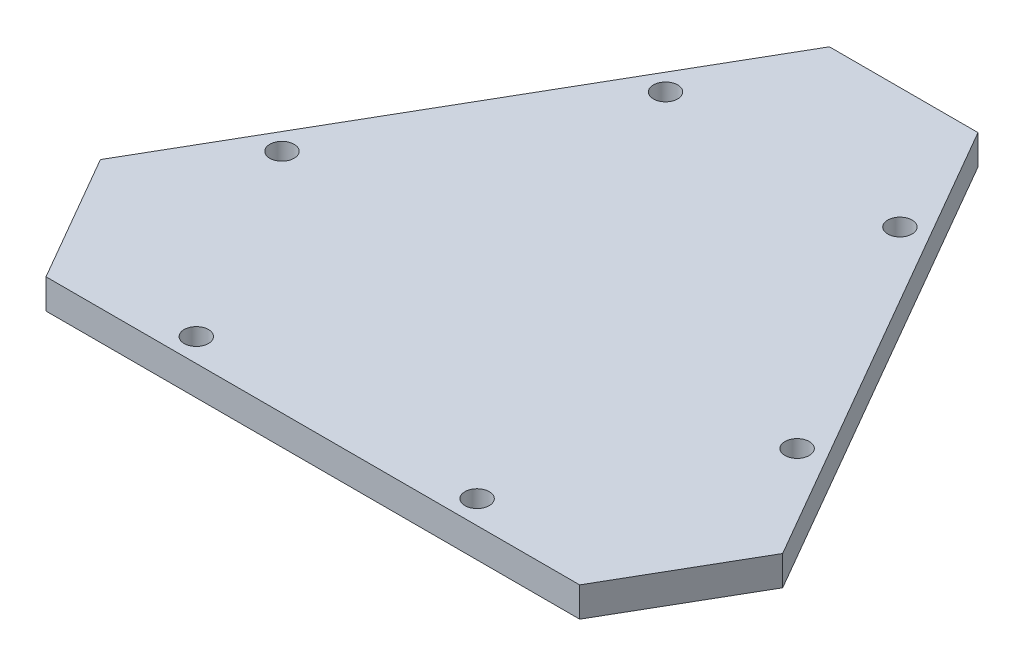
ISO-10303-21;
HEADER;
FILE_DESCRIPTION(('STEP AP214'),'2;1');
FILE_NAME('part.step','',(''),(''),'','','');
FILE_SCHEMA(('AUTOMOTIVE_DESIGN { 1 0 10303 214 1 1 1 1 }'));
ENDSEC;
DATA;
#1=APPLICATION_CONTEXT('core data for automotive mechanical design processes');
#2=APPLICATION_PROTOCOL_DEFINITION('international standard','automotive_design',2000,#1);
#3=PRODUCT_CONTEXT('',#1,'mechanical');
#4=PRODUCT('Part','Part','',(#3));
#5=PRODUCT_RELATED_PRODUCT_CATEGORY('part','',(#4));
#6=PRODUCT_DEFINITION_FORMATION('','',#4);
#7=PRODUCT_DEFINITION_CONTEXT('part definition',#1,'design');
#8=PRODUCT_DEFINITION('design','',#6,#7);
#9=PRODUCT_DEFINITION_SHAPE('','',#8);
#10=(LENGTH_UNIT() NAMED_UNIT(*) SI_UNIT(.MILLI.,.METRE.));
#11=(NAMED_UNIT(*) PLANE_ANGLE_UNIT() SI_UNIT($,.RADIAN.));
#12=(NAMED_UNIT(*) SI_UNIT($,.STERADIAN.) SOLID_ANGLE_UNIT());
#13=UNCERTAINTY_MEASURE_WITH_UNIT(LENGTH_MEASURE(1.E-05),#10,'distance_accuracy_value','');
#14=(GEOMETRIC_REPRESENTATION_CONTEXT(3) GLOBAL_UNCERTAINTY_ASSIGNED_CONTEXT((#13)) GLOBAL_UNIT_ASSIGNED_CONTEXT((#10,
#11,#12)) REPRESENTATION_CONTEXT('',''));
#15=CARTESIAN_POINT('',(0.,0.,0.));
#16=DIRECTION('',(0.,0.,1.));
#17=DIRECTION('',(1.,0.,0.));
#18=AXIS2_PLACEMENT_3D('',#15,#16,#17);
#19=CARTESIAN_POINT('',(-57.014405283833,6.35,51.2481532850778));
#20=DIRECTION('',(0.,0.,-1.));
#21=DIRECTION('',(-1.,0.,0.));
#22=AXIS2_PLACEMENT_3D('',#19,#20,#21);
#23=PLANE('',#22);
#24=DIRECTION('',(1.,0.,0.));
#25=VECTOR('',#24,1.);
#26=CARTESIAN_POINT('',(-57.014405283833,0.,51.2481532850778));
#27=LINE('',#26,#25);
#28=CARTESIAN_POINT('',(-57.014405283833,0.,51.2481532850778));
#29=VERTEX_POINT('',#28);
#30=CARTESIAN_POINT('',(57.0144052838327,0.,51.2481532850782));
#31=VERTEX_POINT('',#30);
#32=EDGE_CURVE('E133',#29,#31,#27,.T.);
#33=ORIENTED_EDGE('',*,*,#32,.T.);
#34=DIRECTION('',(0.,-1.,0.));
#35=VECTOR('',#34,1.);
#36=CARTESIAN_POINT('',(57.0144052838327,6.35,51.2481532850782));
#37=LINE('',#36,#35);
#38=CARTESIAN_POINT('',(57.0144052838327,6.35,51.2481532850782));
#39=VERTEX_POINT('',#38);
#40=EDGE_CURVE('E11',#39,#31,#37,.T.);
#41=ORIENTED_EDGE('',*,*,#40,.F.);
#42=DIRECTION('',(1.,0.,0.));
#43=VECTOR('',#42,1.);
#44=CARTESIAN_POINT('',(-57.014405283833,6.35,51.2481532850778));
#45=LINE('',#44,#43);
#46=CARTESIAN_POINT('',(-57.014405283833,6.35,51.2481532850778));
#47=VERTEX_POINT('',#46);
#48=EDGE_CURVE('E150',#47,#39,#45,.T.);
#49=ORIENTED_EDGE('',*,*,#48,.F.);
#50=DIRECTION('',(0.,-1.,0.));
#51=VECTOR('',#50,1.);
#52=CARTESIAN_POINT('',(-57.014405283833,6.35,51.2481532850778));
#53=LINE('',#52,#51);
#54=EDGE_CURVE('E129',#47,#29,#53,.T.);
#55=ORIENTED_EDGE('',*,*,#54,.T.);
#56=EDGE_LOOP('',(#33,#41,#49,#55));
#57=FACE_BOUND('',#56,.T.);
#58=ADVANCED_FACE('F44',(#57),#23,.F.);
#59=CARTESIAN_POINT('',(57.0144052838327,6.35,51.2481532850782));
#60=DIRECTION('',(-0.866025403784436,0.,-0.500000000000004));
#61=DIRECTION('',(-0.500000000000004,0.,0.866025403784436));
#62=AXIS2_PLACEMENT_3D('',#59,#60,#61);
#63=PLANE('',#62);
#64=DIRECTION('',(0.500000000000004,0.,-0.866025403784436));
#65=VECTOR('',#64,1.);
#66=CARTESIAN_POINT('',(57.0144052838327,0.,51.2481532850782));
#67=LINE('',#66,#65);
#68=CARTESIAN_POINT('',(72.8894052838328,0.,23.7518467149224));
#69=VERTEX_POINT('',#68);
#70=EDGE_CURVE('E137',#31,#69,#67,.T.);
#71=ORIENTED_EDGE('',*,*,#70,.T.);
#72=DIRECTION('',(0.,-1.,0.));
#73=VECTOR('',#72,1.);
#74=CARTESIAN_POINT('',(72.8894052838328,6.35,23.7518467149224));
#75=LINE('',#74,#73);
#76=CARTESIAN_POINT('',(72.8894052838328,6.35,23.7518467149224));
#77=VERTEX_POINT('',#76);
#78=EDGE_CURVE('E53',#77,#69,#75,.T.);
#79=ORIENTED_EDGE('',*,*,#78,.F.);
#80=DIRECTION('',(0.500000000000004,0.,-0.866025403784436));
#81=VECTOR('',#80,1.);
#82=CARTESIAN_POINT('',(57.0144052838327,6.35,51.2481532850782));
#83=LINE('',#82,#81);
#84=EDGE_CURVE('E98',#39,#77,#83,.T.);
#85=ORIENTED_EDGE('',*,*,#84,.F.);
#86=ORIENTED_EDGE('',*,*,#40,.T.);
#87=EDGE_LOOP('',(#71,#79,#85,#86));
#88=FACE_BOUND('',#87,.T.);
#89=ADVANCED_FACE('F179',(#88),#63,.F.);
#90=CARTESIAN_POINT('',(72.8894052838328,6.35,23.7518467149224));
#91=DIRECTION('',(-0.86602540378444,0.,0.499999999999998));
#92=DIRECTION('',(0.499999999999998,0.,0.86602540378444));
#93=AXIS2_PLACEMENT_3D('',#90,#91,#92);
#94=PLANE('',#93);
#95=DIRECTION('',(-0.499999999999998,0.,-0.86602540378444));
#96=VECTOR('',#95,1.);
#97=CARTESIAN_POINT('',(72.8894052838328,0.,23.7518467149224));
#98=LINE('',#97,#96);
#99=CARTESIAN_POINT('',(15.875,0.,-75.));
#100=VERTEX_POINT('',#99);
#101=EDGE_CURVE('E141',#69,#100,#98,.T.);
#102=ORIENTED_EDGE('',*,*,#101,.T.);
#103=DIRECTION('',(0.,-1.,0.));
#104=VECTOR('',#103,1.);
#105=CARTESIAN_POINT('',(15.875,6.35,-75.));
#106=LINE('',#105,#104);
#107=CARTESIAN_POINT('',(15.875,6.35,-75.));
#108=VERTEX_POINT('',#107);
#109=EDGE_CURVE('E122',#108,#100,#106,.T.);
#110=ORIENTED_EDGE('',*,*,#109,.F.);
#111=DIRECTION('',(-0.499999999999998,0.,-0.86602540378444));
#112=VECTOR('',#111,1.);
#113=CARTESIAN_POINT('',(72.8894052838328,6.35,23.7518467149224));
#114=LINE('',#113,#112);
#115=EDGE_CURVE('E111',#77,#108,#114,.T.);
#116=ORIENTED_EDGE('',*,*,#115,.F.);
#117=ORIENTED_EDGE('',*,*,#78,.T.);
#118=EDGE_LOOP('',(#102,#110,#116,#117));
#119=FACE_BOUND('',#118,.T.);
#120=ADVANCED_FACE('F160',(#119),#94,.F.);
#121=CARTESIAN_POINT('',(-15.875,6.35,-75.));
#122=DIRECTION('',(0.,0.,1.));
#123=DIRECTION('',(1.,0.,0.));
#124=AXIS2_PLACEMENT_3D('',#121,#122,#123);
#125=PLANE('',#124);
#126=DIRECTION('',(-1.,0.,0.));
#127=VECTOR('',#126,1.);
#128=CARTESIAN_POINT('',(-15.875,0.,-75.));
#129=LINE('',#128,#127);
#130=CARTESIAN_POINT('',(-15.875,0.,-75.));
#131=VERTEX_POINT('',#130);
#132=EDGE_CURVE('E120',#100,#131,#129,.T.);
#133=ORIENTED_EDGE('',*,*,#132,.T.);
#134=DIRECTION('',(0.,-1.,0.));
#135=VECTOR('',#134,1.);
#136=CARTESIAN_POINT('',(-15.875,6.35,-75.));
#137=LINE('',#136,#135);
#138=CARTESIAN_POINT('',(-15.875,6.35,-75.));
#139=VERTEX_POINT('',#138);
#140=EDGE_CURVE('E117',#139,#131,#137,.T.);
#141=ORIENTED_EDGE('',*,*,#140,.F.);
#142=DIRECTION('',(-1.,0.,0.));
#143=VECTOR('',#142,1.);
#144=CARTESIAN_POINT('',(-15.875,6.35,-75.));
#145=LINE('',#144,#143);
#146=EDGE_CURVE('E105',#108,#139,#145,.T.);
#147=ORIENTED_EDGE('',*,*,#146,.F.);
#148=ORIENTED_EDGE('',*,*,#109,.T.);
#149=EDGE_LOOP('',(#133,#141,#147,#148));
#150=FACE_BOUND('',#149,.T.);
#151=ADVANCED_FACE('F118',(#150),#125,.F.);
#152=CARTESIAN_POINT('',(-15.875,6.35,-75.));
#153=DIRECTION('',(0.866025403784438,0.,0.500000000000001));
#154=DIRECTION('',(0.500000000000001,0.,-0.866025403784438));
#155=AXIS2_PLACEMENT_3D('',#152,#153,#154);
#156=PLANE('',#155);
#157=DIRECTION('',(-0.500000000000001,0.,0.866025403784438));
#158=VECTOR('',#157,1.);
#159=CARTESIAN_POINT('',(-15.875,0.,-75.));
#160=LINE('',#159,#158);
#161=CARTESIAN_POINT('',(-72.8894052838329,0.,23.7518467149219));
#162=VERTEX_POINT('',#161);
#163=EDGE_CURVE('E84',#131,#162,#160,.T.);
#164=ORIENTED_EDGE('',*,*,#163,.T.);
#165=DIRECTION('',(0.,-1.,0.));
#166=VECTOR('',#165,1.);
#167=CARTESIAN_POINT('',(-72.8894052838329,6.35,23.7518467149219));
#168=LINE('',#167,#166);
#169=CARTESIAN_POINT('',(-72.8894052838329,6.35,23.7518467149219));
#170=VERTEX_POINT('',#169);
#171=EDGE_CURVE('E123',#170,#162,#168,.T.);
#172=ORIENTED_EDGE('',*,*,#171,.F.);
#173=DIRECTION('',(-0.500000000000001,0.,0.866025403784438));
#174=VECTOR('',#173,1.);
#175=CARTESIAN_POINT('',(-15.875,6.35,-75.));
#176=LINE('',#175,#174);
#177=EDGE_CURVE('E109',#139,#170,#176,.T.);
#178=ORIENTED_EDGE('',*,*,#177,.F.);
#179=ORIENTED_EDGE('',*,*,#140,.T.);
#180=EDGE_LOOP('',(#164,#172,#178,#179));
#181=FACE_BOUND('',#180,.T.);
#182=ADVANCED_FACE('F125',(#181),#156,.F.);
#183=CARTESIAN_POINT('',(-57.014405283833,6.35,51.2481532850778));
#184=DIRECTION('',(0.86602540378444,0.,-0.499999999999998));
#185=DIRECTION('',(-0.499999999999998,0.,-0.86602540378444));
#186=AXIS2_PLACEMENT_3D('',#183,#184,#185);
#187=PLANE('',#186);
#188=DIRECTION('',(0.499999999999998,0.,0.86602540378444));
#189=VECTOR('',#188,1.);
#190=CARTESIAN_POINT('',(-57.014405283833,0.,51.2481532850778));
#191=LINE('',#190,#189);
#192=EDGE_CURVE('E90',#162,#29,#191,.T.);
#193=ORIENTED_EDGE('',*,*,#192,.T.);
#194=ORIENTED_EDGE('',*,*,#54,.F.);
#195=DIRECTION('',(0.499999999999998,0.,0.86602540378444));
#196=VECTOR('',#195,1.);
#197=CARTESIAN_POINT('',(-57.014405283833,6.35,51.2481532850778));
#198=LINE('',#197,#196);
#199=EDGE_CURVE('E61',#170,#47,#198,.T.);
#200=ORIENTED_EDGE('',*,*,#199,.F.);
#201=ORIENTED_EDGE('',*,*,#171,.T.);
#202=EDGE_LOOP('',(#193,#194,#200,#201));
#203=FACE_BOUND('',#202,.T.);
#204=ADVANCED_FACE('F167',(#203),#187,.F.);
#205=CARTESIAN_POINT('',(0.,6.35,0.));
#206=DIRECTION('',(0.,1.,0.));
#207=DIRECTION('',(0.,0.,1.));
#208=AXIS2_PLACEMENT_3D('',#205,#206,#207);
#209=PLANE('',#208);
#210=CARTESIAN_POINT('',(-55.0301887449073,6.35,2.81877628612842));
#211=DIRECTION('',(0.,1.,0.));
#212=DIRECTION('',(0.,0.,1.));
#213=AXIS2_PLACEMENT_3D('',#210,#211,#212);
#214=CIRCLE('',#213,2.6);
#215=CARTESIAN_POINT('',(-55.0301887449073,6.35,5.41877628612841));
#216=VERTEX_POINT('',#215);
#217=EDGE_CURVE('E327',#216,#216,#214,.T.);
#218=ORIENTED_EDGE('',*,*,#217,.F.);
#219=EDGE_LOOP('',(#218));
#220=FACE_BOUND('',#219,.T.);
#221=CARTESIAN_POINT('',(30.0988433702189,6.35,46.2481532850775));
#222=DIRECTION('',(0.,1.,0.));
#223=DIRECTION('',(0.,0.,1.));
#224=AXIS2_PLACEMENT_3D('',#221,#222,#223);
#225=CIRCLE('',#224,2.6);
#226=CARTESIAN_POINT('',(30.0988433702189,6.35,48.8481532850775));
#227=VERTEX_POINT('',#226);
#228=EDGE_CURVE('E334',#227,#227,#225,.T.);
#229=ORIENTED_EDGE('',*,*,#228,.F.);
#230=EDGE_LOOP('',(#229));
#231=FACE_BOUND('',#230,.T.);
#232=CARTESIAN_POINT('',(55.008731986365,6.35,2.78123818993755));
#233=DIRECTION('',(0.,1.,0.));
#234=DIRECTION('',(0.,0.,1.));
#235=AXIS2_PLACEMENT_3D('',#232,#233,#234);
#236=CIRCLE('',#235,2.6);
#237=CARTESIAN_POINT('',(55.008731986365,6.35,5.38123818993754));
#238=VERTEX_POINT('',#237);
#239=EDGE_CURVE('E349',#238,#238,#236,.T.);
#240=ORIENTED_EDGE('',*,*,#239,.F.);
#241=EDGE_LOOP('',(#240));
#242=FACE_BOUND('',#241,.T.);
#243=CARTESIAN_POINT('',(25.0085700829616,6.35,-49.1801925618189));
#244=DIRECTION('',(0.,1.,0.));
#245=DIRECTION('',(0.,0.,1.));
#246=AXIS2_PLACEMENT_3D('',#243,#244,#245);
#247=CIRCLE('',#246,2.6);
#248=CARTESIAN_POINT('',(25.0085700829616,6.35,-46.5801925618189));
#249=VERTEX_POINT('',#248);
#250=EDGE_CURVE('E340',#249,#249,#247,.T.);
#251=ORIENTED_EDGE('',*,*,#250,.F.);
#252=EDGE_LOOP('',(#251));
#253=FACE_BOUND('',#252,.T.);
#254=CARTESIAN_POINT('',(-29.9011566297811,6.35,46.2481532850778));
#255=DIRECTION('',(0.,1.,0.));
#256=DIRECTION('',(0.,0.,1.));
#257=AXIS2_PLACEMENT_3D('',#254,#255,#256);
#258=CIRCLE('',#257,2.6);
#259=CARTESIAN_POINT('',(-29.9011566297811,6.35,48.8481532850778));
#260=VERTEX_POINT('',#259);
#261=EDGE_CURVE('E336',#260,#260,#258,.T.);
#262=ORIENTED_EDGE('',*,*,#261,.F.);
#263=EDGE_LOOP('',(#262));
#264=FACE_BOUND('',#263,.T.);
#265=CARTESIAN_POINT('',(-25.0303122781621,6.35,-49.1428192627));
#266=DIRECTION('',(0.,1.,0.));
#267=DIRECTION('',(0.,0.,1.));
#268=AXIS2_PLACEMENT_3D('',#265,#266,#267);
#269=CIRCLE('',#268,2.6);
#270=CARTESIAN_POINT('',(-25.0303122781621,6.35,-46.5428192627));
#271=VERTEX_POINT('',#270);
#272=EDGE_CURVE('E344',#271,#271,#269,.T.);
#273=ORIENTED_EDGE('',*,*,#272,.F.);
#274=EDGE_LOOP('',(#273));
#275=FACE_BOUND('',#274,.T.);
#276=ORIENTED_EDGE('',*,*,#48,.T.);
#277=ORIENTED_EDGE('',*,*,#84,.T.);
#278=ORIENTED_EDGE('',*,*,#115,.T.);
#279=ORIENTED_EDGE('',*,*,#146,.T.);
#280=ORIENTED_EDGE('',*,*,#177,.T.);
#281=ORIENTED_EDGE('',*,*,#199,.T.);
#282=EDGE_LOOP('',(#276,#277,#278,#279,#280,#281));
#283=FACE_BOUND('',#282,.T.);
#284=ADVANCED_FACE('F107',(#220,#231,#242,#253,#264,#275,#283),#209,.T.);
#285=CARTESIAN_POINT('',(0.,0.,0.));
#286=DIRECTION('',(0.,1.,0.));
#287=DIRECTION('',(0.,0.,1.));
#288=AXIS2_PLACEMENT_3D('',#285,#286,#287);
#289=PLANE('',#288);
#290=CARTESIAN_POINT('',(-55.0301887449073,0.,2.81877628612842));
#291=DIRECTION('',(0.,1.,0.));
#292=DIRECTION('',(0.,0.,1.));
#293=AXIS2_PLACEMENT_3D('',#290,#291,#292);
#294=CIRCLE('',#293,2.6);
#295=CARTESIAN_POINT('',(-55.0301887449073,0.,5.41877628612841));
#296=VERTEX_POINT('',#295);
#297=EDGE_CURVE('E324',#296,#296,#294,.T.);
#298=ORIENTED_EDGE('',*,*,#297,.T.);
#299=EDGE_LOOP('',(#298));
#300=FACE_BOUND('',#299,.T.);
#301=CARTESIAN_POINT('',(30.0988433702189,0.,46.2481532850775));
#302=DIRECTION('',(0.,1.,0.));
#303=DIRECTION('',(0.,0.,1.));
#304=AXIS2_PLACEMENT_3D('',#301,#302,#303);
#305=CIRCLE('',#304,2.6);
#306=CARTESIAN_POINT('',(30.0988433702189,0.,48.8481532850775));
#307=VERTEX_POINT('',#306);
#308=EDGE_CURVE('E329',#307,#307,#305,.T.);
#309=ORIENTED_EDGE('',*,*,#308,.T.);
#310=EDGE_LOOP('',(#309));
#311=FACE_BOUND('',#310,.T.);
#312=CARTESIAN_POINT('',(55.008731986365,0.,2.78123818993755));
#313=DIRECTION('',(0.,1.,0.));
#314=DIRECTION('',(0.,0.,1.));
#315=AXIS2_PLACEMENT_3D('',#312,#313,#314);
#316=CIRCLE('',#315,2.6);
#317=CARTESIAN_POINT('',(55.008731986365,0.,5.38123818993754));
#318=VERTEX_POINT('',#317);
#319=EDGE_CURVE('E353',#318,#318,#316,.T.);
#320=ORIENTED_EDGE('',*,*,#319,.T.);
#321=EDGE_LOOP('',(#320));
#322=FACE_BOUND('',#321,.T.);
#323=CARTESIAN_POINT('',(25.0085700829616,0.,-49.1801925618189));
#324=DIRECTION('',(0.,1.,0.));
#325=DIRECTION('',(0.,0.,1.));
#326=AXIS2_PLACEMENT_3D('',#323,#324,#325);
#327=CIRCLE('',#326,2.6);
#328=CARTESIAN_POINT('',(25.0085700829616,0.,-46.5801925618189));
#329=VERTEX_POINT('',#328);
#330=EDGE_CURVE('E345',#329,#329,#327,.T.);
#331=ORIENTED_EDGE('',*,*,#330,.T.);
#332=EDGE_LOOP('',(#331));
#333=FACE_BOUND('',#332,.T.);
#334=CARTESIAN_POINT('',(-29.9011566297811,0.,46.2481532850778));
#335=DIRECTION('',(0.,1.,0.));
#336=DIRECTION('',(0.,0.,1.));
#337=AXIS2_PLACEMENT_3D('',#334,#335,#336);
#338=CIRCLE('',#337,2.6);
#339=CARTESIAN_POINT('',(-29.9011566297811,0.,48.8481532850778));
#340=VERTEX_POINT('',#339);
#341=EDGE_CURVE('E372',#340,#340,#338,.T.);
#342=ORIENTED_EDGE('',*,*,#341,.T.);
#343=EDGE_LOOP('',(#342));
#344=FACE_BOUND('',#343,.T.);
#345=CARTESIAN_POINT('',(-25.0303122781621,0.,-49.1428192627));
#346=DIRECTION('',(0.,1.,0.));
#347=DIRECTION('',(0.,0.,1.));
#348=AXIS2_PLACEMENT_3D('',#345,#346,#347);
#349=CIRCLE('',#348,2.6);
#350=CARTESIAN_POINT('',(-25.0303122781621,0.,-46.5428192627));
#351=VERTEX_POINT('',#350);
#352=EDGE_CURVE('E138',#351,#351,#349,.T.);
#353=ORIENTED_EDGE('',*,*,#352,.T.);
#354=EDGE_LOOP('',(#353));
#355=FACE_BOUND('',#354,.T.);
#356=ORIENTED_EDGE('',*,*,#32,.F.);
#357=ORIENTED_EDGE('',*,*,#192,.F.);
#358=ORIENTED_EDGE('',*,*,#163,.F.);
#359=ORIENTED_EDGE('',*,*,#132,.F.);
#360=ORIENTED_EDGE('',*,*,#101,.F.);
#361=ORIENTED_EDGE('',*,*,#70,.F.);
#362=EDGE_LOOP('',(#356,#357,#358,#359,#360,#361));
#363=FACE_BOUND('',#362,.T.);
#364=ADVANCED_FACE('F163',(#300,#311,#322,#333,#344,#355,#363),#289,.F.);
#365=CARTESIAN_POINT('',(-25.0303122781621,0.,-49.1428192627));
#366=DIRECTION('',(0.,1.,0.));
#367=DIRECTION('',(0.,0.,1.));
#368=AXIS2_PLACEMENT_3D('',#365,#366,#367);
#369=CYLINDRICAL_SURFACE('',#368,2.6);
#370=ORIENTED_EDGE('',*,*,#352,.F.);
#371=EDGE_LOOP('',(#370));
#372=FACE_BOUND('',#371,.T.);
#373=ORIENTED_EDGE('',*,*,#272,.T.);
#374=EDGE_LOOP('',(#373));
#375=FACE_BOUND('',#374,.T.);
#376=ADVANCED_FACE('F219',(#372,#375),#369,.F.);
#377=CARTESIAN_POINT('',(-29.9011566297811,0.,46.2481532850778));
#378=DIRECTION('',(0.,1.,0.));
#379=DIRECTION('',(0.,0.,1.));
#380=AXIS2_PLACEMENT_3D('',#377,#378,#379);
#381=CYLINDRICAL_SURFACE('',#380,2.6);
#382=ORIENTED_EDGE('',*,*,#341,.F.);
#383=EDGE_LOOP('',(#382));
#384=FACE_BOUND('',#383,.T.);
#385=ORIENTED_EDGE('',*,*,#261,.T.);
#386=EDGE_LOOP('',(#385));
#387=FACE_BOUND('',#386,.T.);
#388=ADVANCED_FACE('F229',(#384,#387),#381,.F.);
#389=CARTESIAN_POINT('',(25.0085700829616,0.,-49.1801925618189));
#390=DIRECTION('',(0.,1.,0.));
#391=DIRECTION('',(0.,0.,1.));
#392=AXIS2_PLACEMENT_3D('',#389,#390,#391);
#393=CYLINDRICAL_SURFACE('',#392,2.6);
#394=ORIENTED_EDGE('',*,*,#330,.F.);
#395=EDGE_LOOP('',(#394));
#396=FACE_BOUND('',#395,.T.);
#397=ORIENTED_EDGE('',*,*,#250,.T.);
#398=EDGE_LOOP('',(#397));
#399=FACE_BOUND('',#398,.T.);
#400=ADVANCED_FACE('F240',(#396,#399),#393,.F.);
#401=CARTESIAN_POINT('',(55.008731986365,0.,2.78123818993755));
#402=DIRECTION('',(0.,1.,0.));
#403=DIRECTION('',(0.,0.,1.));
#404=AXIS2_PLACEMENT_3D('',#401,#402,#403);
#405=CYLINDRICAL_SURFACE('',#404,2.6);
#406=ORIENTED_EDGE('',*,*,#319,.F.);
#407=EDGE_LOOP('',(#406));
#408=FACE_BOUND('',#407,.T.);
#409=ORIENTED_EDGE('',*,*,#239,.T.);
#410=EDGE_LOOP('',(#409));
#411=FACE_BOUND('',#410,.T.);
#412=ADVANCED_FACE('F251',(#408,#411),#405,.F.);
#413=CARTESIAN_POINT('',(30.0988433702189,0.,46.2481532850775));
#414=DIRECTION('',(0.,1.,0.));
#415=DIRECTION('',(0.,0.,1.));
#416=AXIS2_PLACEMENT_3D('',#413,#414,#415);
#417=CYLINDRICAL_SURFACE('',#416,2.6);
#418=ORIENTED_EDGE('',*,*,#308,.F.);
#419=EDGE_LOOP('',(#418));
#420=FACE_BOUND('',#419,.T.);
#421=ORIENTED_EDGE('',*,*,#228,.T.);
#422=EDGE_LOOP('',(#421));
#423=FACE_BOUND('',#422,.T.);
#424=ADVANCED_FACE('F262',(#420,#423),#417,.F.);
#425=CARTESIAN_POINT('',(-55.0301887449073,0.,2.81877628612842));
#426=DIRECTION('',(0.,1.,0.));
#427=DIRECTION('',(0.,0.,1.));
#428=AXIS2_PLACEMENT_3D('',#425,#426,#427);
#429=CYLINDRICAL_SURFACE('',#428,2.6);
#430=ORIENTED_EDGE('',*,*,#297,.F.);
#431=EDGE_LOOP('',(#430));
#432=FACE_BOUND('',#431,.T.);
#433=ORIENTED_EDGE('',*,*,#217,.T.);
#434=EDGE_LOOP('',(#433));
#435=FACE_BOUND('',#434,.T.);
#436=ADVANCED_FACE('F273',(#432,#435),#429,.F.);
#437=CLOSED_SHELL('',(#58,#89,#120,#151,#182,#204,#284,#364,#376,#388,#400,#412,#424,#436));
#438=MANIFOLD_SOLID_BREP('B2',#437);
#439=ADVANCED_BREP_SHAPE_REPRESENTATION('',(#18,#438),#14);
#440=SHAPE_DEFINITION_REPRESENTATION(#9,#439);
ENDSEC;
END-ISO-10303-21;
